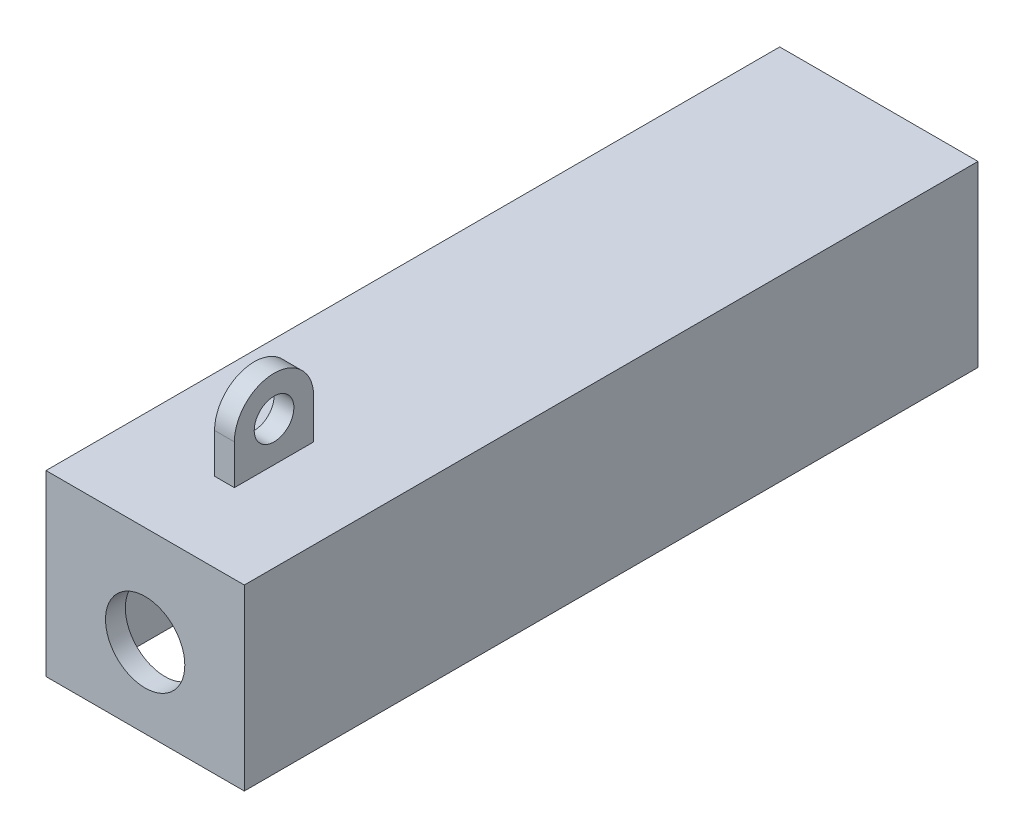
ISO-10303-21;
HEADER;
FILE_DESCRIPTION(('STEP AP214'),'2;1');
FILE_NAME('part.step','',(''),(''),'','','');
FILE_SCHEMA(('AUTOMOTIVE_DESIGN { 1 0 10303 214 1 1 1 1 }'));
ENDSEC;
DATA;
#1=APPLICATION_CONTEXT('core data for automotive mechanical design processes');
#2=APPLICATION_PROTOCOL_DEFINITION('international standard','automotive_design',2000,#1);
#3=PRODUCT_CONTEXT('',#1,'mechanical');
#4=PRODUCT('Part','Part','',(#3));
#5=PRODUCT_RELATED_PRODUCT_CATEGORY('part','',(#4));
#6=PRODUCT_DEFINITION_FORMATION('','',#4);
#7=PRODUCT_DEFINITION_CONTEXT('part definition',#1,'design');
#8=PRODUCT_DEFINITION('design','',#6,#7);
#9=PRODUCT_DEFINITION_SHAPE('','',#8);
#10=(LENGTH_UNIT() NAMED_UNIT(*) SI_UNIT(.MILLI.,.METRE.));
#11=(NAMED_UNIT(*) PLANE_ANGLE_UNIT() SI_UNIT($,.RADIAN.));
#12=(NAMED_UNIT(*) SI_UNIT($,.STERADIAN.) SOLID_ANGLE_UNIT());
#13=UNCERTAINTY_MEASURE_WITH_UNIT(LENGTH_MEASURE(1.E-05),#10,'distance_accuracy_value','');
#14=(GEOMETRIC_REPRESENTATION_CONTEXT(3) GLOBAL_UNCERTAINTY_ASSIGNED_CONTEXT((#13)) GLOBAL_UNIT_ASSIGNED_CONTEXT((#10,
#11,#12)) REPRESENTATION_CONTEXT('',''));
#15=CARTESIAN_POINT('',(0.,0.,0.));
#16=DIRECTION('',(0.,0.,1.));
#17=DIRECTION('',(1.,0.,0.));
#18=AXIS2_PLACEMENT_3D('',#15,#16,#17);
#19=CARTESIAN_POINT('',(-7.06632925965482,24.3632094956515,-22.225));
#20=DIRECTION('',(1.,0.,0.));
#21=DIRECTION('',(0.,0.,-1.));
#22=AXIS2_PLACEMENT_3D('',#19,#20,#21);
#23=PLANE('',#22);
#24=CARTESIAN_POINT('',(-7.06632925965482,18.0132094956515,-15.875));
#25=DIRECTION('',(1.,0.,0.));
#26=DIRECTION('',(0.,0.,-1.));
#27=AXIS2_PLACEMENT_3D('',#24,#25,#26);
#28=CIRCLE('',#27,3.175);
#29=CARTESIAN_POINT('',(-7.06632925965482,21.1882094956515,-15.875));
#30=VERTEX_POINT('',#29);
#31=EDGE_CURVE('E161',#30,#30,#28,.T.);
#32=ORIENTED_EDGE('',*,*,#31,.T.);
#33=EDGE_LOOP('',(#32));
#34=FACE_BOUND('',#33,.T.);
#35=DIRECTION('',(0.,-1.,0.));
#36=VECTOR('',#35,1.);
#37=CARTESIAN_POINT('',(-7.06632925965482,24.3632094956515,-9.525));
#38=LINE('',#37,#36);
#39=CARTESIAN_POINT('',(-7.06632925965483,18.0132094956515,-9.525));
#40=VERTEX_POINT('',#39);
#41=CARTESIAN_POINT('',(-7.06632925965482,11.6632094956515,-9.525));
#42=VERTEX_POINT('',#41);
#43=EDGE_CURVE('E75',#40,#42,#38,.T.);
#44=ORIENTED_EDGE('',*,*,#43,.F.);
#45=CARTESIAN_POINT('',(-7.06632925965482,18.0132094956515,-15.875));
#46=DIRECTION('',(1.,0.,0.));
#47=DIRECTION('',(0.,0.,-1.));
#48=AXIS2_PLACEMENT_3D('',#45,#46,#47);
#49=CIRCLE('',#48,6.35);
#50=CARTESIAN_POINT('',(-7.06632925965483,18.0132094956515,-22.225));
#51=VERTEX_POINT('',#50);
#52=EDGE_CURVE('E160',#51,#40,#49,.T.);
#53=ORIENTED_EDGE('',*,*,#52,.F.);
#54=DIRECTION('',(0.,-1.,0.));
#55=VECTOR('',#54,1.);
#56=CARTESIAN_POINT('',(-7.06632925965482,24.3632094956515,-22.225));
#57=LINE('',#56,#55);
#58=CARTESIAN_POINT('',(-7.06632925965482,11.6632094956515,-22.225));
#59=VERTEX_POINT('',#58);
#60=EDGE_CURVE('E168',#51,#59,#57,.T.);
#61=ORIENTED_EDGE('',*,*,#60,.T.);
#62=DIRECTION('',(0.,0.,1.));
#63=VECTOR('',#62,1.);
#64=CARTESIAN_POINT('',(-7.06632925965482,11.6632094956515,-22.225));
#65=LINE('',#64,#63);
#66=EDGE_CURVE('E327',#59,#42,#65,.T.);
#67=ORIENTED_EDGE('',*,*,#66,.T.);
#68=EDGE_LOOP('',(#44,#53,#61,#67));
#69=FACE_BOUND('',#68,.T.);
#70=ADVANCED_FACE('F58',(#34,#69),#23,.F.);
#71=CARTESIAN_POINT('',(-3.89132925965482,24.3632094956515,-22.225));
#72=DIRECTION('',(-1.,0.,0.));
#73=DIRECTION('',(0.,-1.,0.));
#74=AXIS2_PLACEMENT_3D('',#71,#72,#73);
#75=PLANE('',#74);
#76=CARTESIAN_POINT('',(-3.89132925965482,18.0132094956515,-15.875));
#77=DIRECTION('',(1.,0.,0.));
#78=DIRECTION('',(0.,1.,0.));
#79=AXIS2_PLACEMENT_3D('',#76,#77,#78);
#80=CIRCLE('',#79,3.175);
#81=CARTESIAN_POINT('',(-3.89132925965482,21.1882094956515,-15.875));
#82=VERTEX_POINT('',#81);
#83=EDGE_CURVE('E320',#82,#82,#80,.T.);
#84=ORIENTED_EDGE('',*,*,#83,.F.);
#85=EDGE_LOOP('',(#84));
#86=FACE_BOUND('',#85,.T.);
#87=CARTESIAN_POINT('',(-3.89132925965482,18.0132094956515,-15.875));
#88=DIRECTION('',(1.,0.,0.));
#89=DIRECTION('',(0.,1.,0.));
#90=AXIS2_PLACEMENT_3D('',#87,#88,#89);
#91=CIRCLE('',#90,6.35);
#92=CARTESIAN_POINT('',(-3.89132925965482,18.0132094956515,-22.225));
#93=VERTEX_POINT('',#92);
#94=CARTESIAN_POINT('',(-3.89132925965482,18.0132094956515,-9.525));
#95=VERTEX_POINT('',#94);
#96=EDGE_CURVE('E149',#93,#95,#91,.T.);
#97=ORIENTED_EDGE('',*,*,#96,.T.);
#98=DIRECTION('',(0.,-1.,0.));
#99=VECTOR('',#98,1.);
#100=CARTESIAN_POINT('',(-3.89132925965482,24.3632094956515,-9.525));
#101=LINE('',#100,#99);
#102=CARTESIAN_POINT('',(-3.89132925965482,11.6632094956515,-9.525));
#103=VERTEX_POINT('',#102);
#104=EDGE_CURVE('E83',#95,#103,#101,.T.);
#105=ORIENTED_EDGE('',*,*,#104,.T.);
#106=DIRECTION('',(0.,0.,-1.));
#107=VECTOR('',#106,1.);
#108=CARTESIAN_POINT('',(-3.89132925965482,11.6632094956515,-22.225));
#109=LINE('',#108,#107);
#110=CARTESIAN_POINT('',(-3.89132925965482,11.6632094956515,-22.225));
#111=VERTEX_POINT('',#110);
#112=EDGE_CURVE('E331',#103,#111,#109,.T.);
#113=ORIENTED_EDGE('',*,*,#112,.T.);
#114=DIRECTION('',(0.,-1.,0.));
#115=VECTOR('',#114,1.);
#116=CARTESIAN_POINT('',(-3.89132925965482,24.3632094956515,-22.225));
#117=LINE('',#116,#115);
#118=EDGE_CURVE('E152',#93,#111,#117,.T.);
#119=ORIENTED_EDGE('',*,*,#118,.F.);
#120=EDGE_LOOP('',(#97,#105,#113,#119));
#121=FACE_BOUND('',#120,.T.);
#122=ADVANCED_FACE('F151',(#86,#121),#75,.F.);
#123=CARTESIAN_POINT('',(-7.06632925965482,24.3632094956515,-9.525));
#124=DIRECTION('',(0.,0.,-1.));
#125=DIRECTION('',(-1.,0.,0.));
#126=AXIS2_PLACEMENT_3D('',#123,#124,#125);
#127=PLANE('',#126);
#128=DIRECTION('',(1.,0.,0.));
#129=VECTOR('',#128,1.);
#130=CARTESIAN_POINT('',(-21.3538292596548,18.0132094956515,-9.525));
#131=LINE('',#130,#129);
#132=EDGE_CURVE('E156',#40,#95,#131,.T.);
#133=ORIENTED_EDGE('',*,*,#132,.F.);
#134=ORIENTED_EDGE('',*,*,#43,.T.);
#135=DIRECTION('',(1.,0.,0.));
#136=VECTOR('',#135,1.);
#137=CARTESIAN_POINT('',(-7.06632925965482,11.6632094956515,-9.525));
#138=LINE('',#137,#136);
#139=EDGE_CURVE('E164',#42,#103,#138,.T.);
#140=ORIENTED_EDGE('',*,*,#139,.T.);
#141=ORIENTED_EDGE('',*,*,#104,.F.);
#142=EDGE_LOOP('',(#133,#134,#140,#141));
#143=FACE_BOUND('',#142,.T.);
#144=ADVANCED_FACE('F163',(#143),#127,.F.);
#145=CARTESIAN_POINT('',(10.3961707403452,11.6632094956515,3.175));
#146=DIRECTION('',(0.,-1.,0.));
#147=DIRECTION('',(1.,0.,0.));
#148=AXIS2_PLACEMENT_3D('',#145,#146,#147);
#149=PLANE('',#148);
#150=DIRECTION('',(0.,0.,-1.));
#151=VECTOR('',#150,1.);
#152=CARTESIAN_POINT('',(10.3961707403452,11.6632094956515,3.175));
#153=LINE('',#152,#151);
#154=CARTESIAN_POINT('',(10.3961707403452,11.6632094956515,3.175));
#155=VERTEX_POINT('',#154);
#156=CARTESIAN_POINT('',(10.3961707403452,11.6632094956515,-114.3));
#157=VERTEX_POINT('',#156);
#158=EDGE_CURVE('E12',#155,#157,#153,.T.);
#159=ORIENTED_EDGE('',*,*,#158,.T.);
#160=DIRECTION('',(1.,0.,0.));
#161=VECTOR('',#160,1.);
#162=CARTESIAN_POINT('',(10.3961707403452,11.6632094956515,-114.3));
#163=LINE('',#162,#161);
#164=CARTESIAN_POINT('',(-21.3538292596548,11.6632094956515,-114.3));
#165=VERTEX_POINT('',#164);
#166=EDGE_CURVE('E175',#165,#157,#163,.T.);
#167=ORIENTED_EDGE('',*,*,#166,.F.);
#168=DIRECTION('',(0.,0.,-1.));
#169=VECTOR('',#168,1.);
#170=CARTESIAN_POINT('',(-21.3538292596548,11.6632094956515,3.175));
#171=LINE('',#170,#169);
#172=CARTESIAN_POINT('',(-21.3538292596548,11.6632094956515,3.175));
#173=VERTEX_POINT('',#172);
#174=EDGE_CURVE('E67',#173,#165,#171,.T.);
#175=ORIENTED_EDGE('',*,*,#174,.F.);
#176=DIRECTION('',(-1.,0.,0.));
#177=VECTOR('',#176,1.);
#178=CARTESIAN_POINT('',(10.3961707403452,11.6632094956515,3.175));
#179=LINE('',#178,#177);
#180=EDGE_CURVE('E233',#155,#173,#179,.T.);
#181=ORIENTED_EDGE('',*,*,#180,.F.);
#182=EDGE_LOOP('',(#159,#167,#175,#181));
#183=FACE_BOUND('',#182,.T.);
#184=ORIENTED_EDGE('',*,*,#66,.F.);
#185=DIRECTION('',(-1.,0.,0.));
#186=VECTOR('',#185,1.);
#187=CARTESIAN_POINT('',(-7.06632925965482,11.6632094956515,-22.225));
#188=LINE('',#187,#186);
#189=EDGE_CURVE('E333',#111,#59,#188,.T.);
#190=ORIENTED_EDGE('',*,*,#189,.F.);
#191=ORIENTED_EDGE('',*,*,#112,.F.);
#192=ORIENTED_EDGE('',*,*,#139,.F.);
#193=EDGE_LOOP('',(#184,#190,#191,#192));
#194=FACE_BOUND('',#193,.T.);
#195=ADVANCED_FACE('F274',(#183,#194),#149,.F.);
#196=CARTESIAN_POINT('',(0.,0.,0.));
#197=DIRECTION('',(0.,0.,1.));
#198=DIRECTION('',(1.,0.,0.));
#199=AXIS2_PLACEMENT_3D('',#196,#197,#198);
#200=PLANE('',#199);
#201=CARTESIAN_POINT('',(-5.47882925965482,-4.21179050434855,0.));
#202=DIRECTION('',(0.,0.,1.));
#203=DIRECTION('',(1.,0.,0.));
#204=AXIS2_PLACEMENT_3D('',#201,#202,#203);
#205=CIRCLE('',#204,6.35);
#206=CARTESIAN_POINT('',(0.871170740345177,-4.21179050434855,0.));
#207=VERTEX_POINT('',#206);
#208=EDGE_CURVE('E224',#207,#207,#205,.T.);
#209=ORIENTED_EDGE('',*,*,#208,.T.);
#210=EDGE_LOOP('',(#209));
#211=FACE_BOUND('',#210,.T.);
#212=DIRECTION('',(0.,-1.,0.));
#213=VECTOR('',#212,1.);
#214=CARTESIAN_POINT('',(-18.1788292596548,-16.9117905043486,0.));
#215=LINE('',#214,#213);
#216=CARTESIAN_POINT('',(-18.1788292596548,8.48820949565145,0.));
#217=VERTEX_POINT('',#216);
#218=CARTESIAN_POINT('',(-18.1788292596548,-16.9117905043486,0.));
#219=VERTEX_POINT('',#218);
#220=EDGE_CURVE('E176',#217,#219,#215,.T.);
#221=ORIENTED_EDGE('',*,*,#220,.F.);
#222=DIRECTION('',(-1.,0.,0.));
#223=VECTOR('',#222,1.);
#224=CARTESIAN_POINT('',(-18.1788292596548,8.48820949565145,0.));
#225=LINE('',#224,#223);
#226=CARTESIAN_POINT('',(7.22117074034518,8.48820949565145,0.));
#227=VERTEX_POINT('',#226);
#228=EDGE_CURVE('E194',#227,#217,#225,.T.);
#229=ORIENTED_EDGE('',*,*,#228,.F.);
#230=DIRECTION('',(0.,1.,0.));
#231=VECTOR('',#230,1.);
#232=CARTESIAN_POINT('',(7.22117074034518,8.48820949565145,0.));
#233=LINE('',#232,#231);
#234=CARTESIAN_POINT('',(7.22117074034517,-16.9117905043485,0.));
#235=VERTEX_POINT('',#234);
#236=EDGE_CURVE('E166',#235,#227,#233,.T.);
#237=ORIENTED_EDGE('',*,*,#236,.F.);
#238=DIRECTION('',(1.,0.,0.));
#239=VECTOR('',#238,1.);
#240=CARTESIAN_POINT('',(10.3961707403452,-16.9117905043485,0.));
#241=LINE('',#240,#239);
#242=EDGE_CURVE('E227',#219,#235,#241,.T.);
#243=ORIENTED_EDGE('',*,*,#242,.F.);
#244=EDGE_LOOP('',(#221,#229,#237,#243));
#245=FACE_BOUND('',#244,.T.);
#246=ADVANCED_FACE('F254',(#211,#245),#200,.F.);
#247=CARTESIAN_POINT('',(10.3961707403452,-16.9117905043485,3.175));
#248=DIRECTION('',(-1.,0.,0.));
#249=DIRECTION('',(0.,0.,1.));
#250=AXIS2_PLACEMENT_3D('',#247,#248,#249);
#251=PLANE('',#250);
#252=DIRECTION('',(0.,0.,-1.));
#253=VECTOR('',#252,1.);
#254=CARTESIAN_POINT('',(10.3961707403452,-16.9117905043485,3.175));
#255=LINE('',#254,#253);
#256=CARTESIAN_POINT('',(10.3961707403452,-16.9117905043485,3.175));
#257=VERTEX_POINT('',#256);
#258=CARTESIAN_POINT('',(10.3961707403452,-16.9117905043485,-114.3));
#259=VERTEX_POINT('',#258);
#260=EDGE_CURVE('E239',#257,#259,#255,.T.);
#261=ORIENTED_EDGE('',*,*,#260,.T.);
#262=DIRECTION('',(0.,-1.,0.));
#263=VECTOR('',#262,1.);
#264=CARTESIAN_POINT('',(10.3961707403452,-16.9117905043485,-114.3));
#265=LINE('',#264,#263);
#266=EDGE_CURVE('E179',#157,#259,#265,.T.);
#267=ORIENTED_EDGE('',*,*,#266,.F.);
#268=ORIENTED_EDGE('',*,*,#158,.F.);
#269=DIRECTION('',(0.,1.,0.));
#270=VECTOR('',#269,1.);
#271=CARTESIAN_POINT('',(10.3961707403452,-16.9117905043485,3.175));
#272=LINE('',#271,#270);
#273=EDGE_CURVE('E230',#257,#155,#272,.T.);
#274=ORIENTED_EDGE('',*,*,#273,.F.);
#275=EDGE_LOOP('',(#261,#267,#268,#274));
#276=FACE_BOUND('',#275,.T.);
#277=ADVANCED_FACE('F60',(#276),#251,.F.);
#278=CARTESIAN_POINT('',(-21.3538292596548,-16.9117905043486,3.175));
#279=DIRECTION('',(1.,0.,0.));
#280=DIRECTION('',(0.,0.,-1.));
#281=AXIS2_PLACEMENT_3D('',#278,#279,#280);
#282=PLANE('',#281);
#283=ORIENTED_EDGE('',*,*,#174,.T.);
#284=DIRECTION('',(0.,1.,0.));
#285=VECTOR('',#284,1.);
#286=CARTESIAN_POINT('',(-21.3538292596548,11.6632094956515,-114.3));
#287=LINE('',#286,#285);
#288=CARTESIAN_POINT('',(-21.3538292596548,-16.9117905043486,-114.3));
#289=VERTEX_POINT('',#288);
#290=EDGE_CURVE('E172',#289,#165,#287,.T.);
#291=ORIENTED_EDGE('',*,*,#290,.F.);
#292=DIRECTION('',(0.,0.,-1.));
#293=VECTOR('',#292,1.);
#294=CARTESIAN_POINT('',(-21.3538292596548,-16.9117905043486,3.175));
#295=LINE('',#294,#293);
#296=CARTESIAN_POINT('',(-21.3538292596548,-16.9117905043486,3.175));
#297=VERTEX_POINT('',#296);
#298=EDGE_CURVE('E266',#297,#289,#295,.T.);
#299=ORIENTED_EDGE('',*,*,#298,.F.);
#300=DIRECTION('',(0.,-1.,0.));
#301=VECTOR('',#300,1.);
#302=CARTESIAN_POINT('',(-21.3538292596548,-16.9117905043486,3.175));
#303=LINE('',#302,#301);
#304=EDGE_CURVE('E235',#173,#297,#303,.T.);
#305=ORIENTED_EDGE('',*,*,#304,.F.);
#306=EDGE_LOOP('',(#283,#291,#299,#305));
#307=FACE_BOUND('',#306,.T.);
#308=ADVANCED_FACE('F272',(#307),#282,.F.);
#309=CARTESIAN_POINT('',(10.3961707403452,-16.9117905043485,3.175));
#310=DIRECTION('',(0.,1.,0.));
#311=DIRECTION('',(-1.,0.,0.));
#312=AXIS2_PLACEMENT_3D('',#309,#310,#311);
#313=PLANE('',#312);
#314=ORIENTED_EDGE('',*,*,#298,.T.);
#315=DIRECTION('',(-1.,0.,0.));
#316=VECTOR('',#315,1.);
#317=CARTESIAN_POINT('',(-21.3538292596548,-16.9117905043486,-114.3));
#318=LINE('',#317,#316);
#319=CARTESIAN_POINT('',(-18.1788292596548,-16.9117905043486,-114.3));
#320=VERTEX_POINT('',#319);
#321=EDGE_CURVE('E190',#320,#289,#318,.T.);
#322=ORIENTED_EDGE('',*,*,#321,.F.);
#323=DIRECTION('',(0.,0.,1.));
#324=VECTOR('',#323,1.);
#325=CARTESIAN_POINT('',(-18.1788292596548,-16.9117905043486,-114.3));
#326=LINE('',#325,#324);
#327=EDGE_CURVE('E193',#320,#219,#326,.T.);
#328=ORIENTED_EDGE('',*,*,#327,.T.);
#329=ORIENTED_EDGE('',*,*,#242,.T.);
#330=DIRECTION('',(0.,0.,1.));
#331=VECTOR('',#330,1.);
#332=CARTESIAN_POINT('',(7.22117074034517,-16.9117905043486,-114.3));
#333=LINE('',#332,#331);
#334=CARTESIAN_POINT('',(7.22117074034517,-16.9117905043486,-114.3));
#335=VERTEX_POINT('',#334);
#336=EDGE_CURVE('E217',#335,#235,#333,.T.);
#337=ORIENTED_EDGE('',*,*,#336,.F.);
#338=DIRECTION('',(-1.,0.,0.));
#339=VECTOR('',#338,1.);
#340=CARTESIAN_POINT('',(7.22117074034517,-16.9117905043486,-114.3));
#341=LINE('',#340,#339);
#342=EDGE_CURVE('E182',#259,#335,#341,.T.);
#343=ORIENTED_EDGE('',*,*,#342,.F.);
#344=ORIENTED_EDGE('',*,*,#260,.F.);
#345=DIRECTION('',(1.,0.,0.));
#346=VECTOR('',#345,1.);
#347=CARTESIAN_POINT('',(10.3961707403452,-16.9117905043485,3.175));
#348=LINE('',#347,#346);
#349=EDGE_CURVE('E237',#297,#257,#348,.T.);
#350=ORIENTED_EDGE('',*,*,#349,.F.);
#351=EDGE_LOOP('',(#314,#322,#328,#329,#337,#343,#344,#350));
#352=FACE_BOUND('',#351,.T.);
#353=ADVANCED_FACE('F255',(#352),#313,.F.);
#354=CARTESIAN_POINT('',(0.,0.,3.175));
#355=DIRECTION('',(0.,0.,1.));
#356=DIRECTION('',(1.,0.,0.));
#357=AXIS2_PLACEMENT_3D('',#354,#355,#356);
#358=PLANE('',#357);
#359=CARTESIAN_POINT('',(-5.47882925965482,-4.21179050434855,3.175));
#360=DIRECTION('',(0.,0.,1.));
#361=DIRECTION('',(1.,0.,0.));
#362=AXIS2_PLACEMENT_3D('',#359,#360,#361);
#363=CIRCLE('',#362,6.35);
#364=CARTESIAN_POINT('',(0.871170740345177,-4.21179050434855,3.175));
#365=VERTEX_POINT('',#364);
#366=EDGE_CURVE('E222',#365,#365,#363,.T.);
#367=ORIENTED_EDGE('',*,*,#366,.F.);
#368=EDGE_LOOP('',(#367));
#369=FACE_BOUND('',#368,.T.);
#370=ORIENTED_EDGE('',*,*,#273,.T.);
#371=ORIENTED_EDGE('',*,*,#180,.T.);
#372=ORIENTED_EDGE('',*,*,#304,.T.);
#373=ORIENTED_EDGE('',*,*,#349,.T.);
#374=EDGE_LOOP('',(#370,#371,#372,#373));
#375=FACE_BOUND('',#374,.T.);
#376=ADVANCED_FACE('F348',(#369,#375),#358,.T.);
#377=CARTESIAN_POINT('',(-5.47882925965482,-4.21179050434855,0.));
#378=DIRECTION('',(0.,0.,1.));
#379=DIRECTION('',(1.,0.,0.));
#380=AXIS2_PLACEMENT_3D('',#377,#378,#379);
#381=CYLINDRICAL_SURFACE('',#380,6.35);
#382=ORIENTED_EDGE('',*,*,#208,.F.);
#383=EDGE_LOOP('',(#382));
#384=FACE_BOUND('',#383,.T.);
#385=ORIENTED_EDGE('',*,*,#366,.T.);
#386=EDGE_LOOP('',(#385));
#387=FACE_BOUND('',#386,.T.);
#388=ADVANCED_FACE('F285',(#384,#387),#381,.F.);
#389=CARTESIAN_POINT('',(7.22117074034518,8.48820949565145,-114.3));
#390=DIRECTION('',(1.,0.,0.));
#391=DIRECTION('',(0.,1.,0.));
#392=AXIS2_PLACEMENT_3D('',#389,#390,#391);
#393=PLANE('',#392);
#394=ORIENTED_EDGE('',*,*,#236,.T.);
#395=DIRECTION('',(0.,0.,1.));
#396=VECTOR('',#395,1.);
#397=CARTESIAN_POINT('',(7.22117074034518,8.48820949565145,-114.3));
#398=LINE('',#397,#396);
#399=CARTESIAN_POINT('',(7.22117074034518,8.48820949565145,-114.3));
#400=VERTEX_POINT('',#399);
#401=EDGE_CURVE('E212',#400,#227,#398,.T.);
#402=ORIENTED_EDGE('',*,*,#401,.F.);
#403=DIRECTION('',(0.,1.,0.));
#404=VECTOR('',#403,1.);
#405=CARTESIAN_POINT('',(7.22117074034518,8.48820949565145,-114.3));
#406=LINE('',#405,#404);
#407=EDGE_CURVE('E184',#335,#400,#406,.T.);
#408=ORIENTED_EDGE('',*,*,#407,.F.);
#409=ORIENTED_EDGE('',*,*,#336,.T.);
#410=EDGE_LOOP('',(#394,#402,#408,#409));
#411=FACE_BOUND('',#410,.T.);
#412=ADVANCED_FACE('F250',(#411),#393,.F.);
#413=CARTESIAN_POINT('',(-18.1788292596548,8.48820949565145,-114.3));
#414=DIRECTION('',(0.,1.,0.));
#415=DIRECTION('',(-1.,0.,0.));
#416=AXIS2_PLACEMENT_3D('',#413,#414,#415);
#417=PLANE('',#416);
#418=ORIENTED_EDGE('',*,*,#228,.T.);
#419=DIRECTION('',(0.,0.,1.));
#420=VECTOR('',#419,1.);
#421=CARTESIAN_POINT('',(-18.1788292596548,8.48820949565145,-114.3));
#422=LINE('',#421,#420);
#423=CARTESIAN_POINT('',(-18.1788292596548,8.48820949565145,-114.3));
#424=VERTEX_POINT('',#423);
#425=EDGE_CURVE('E199',#424,#217,#422,.T.);
#426=ORIENTED_EDGE('',*,*,#425,.F.);
#427=DIRECTION('',(-1.,0.,0.));
#428=VECTOR('',#427,1.);
#429=CARTESIAN_POINT('',(-18.1788292596548,8.48820949565145,-114.3));
#430=LINE('',#429,#428);
#431=EDGE_CURVE('E186',#400,#424,#430,.T.);
#432=ORIENTED_EDGE('',*,*,#431,.F.);
#433=ORIENTED_EDGE('',*,*,#401,.T.);
#434=EDGE_LOOP('',(#418,#426,#432,#433));
#435=FACE_BOUND('',#434,.T.);
#436=ADVANCED_FACE('F277',(#435),#417,.F.);
#437=CARTESIAN_POINT('',(-18.1788292596548,-16.9117905043486,-114.3));
#438=DIRECTION('',(-1.,0.,0.));
#439=DIRECTION('',(0.,0.,1.));
#440=AXIS2_PLACEMENT_3D('',#437,#438,#439);
#441=PLANE('',#440);
#442=ORIENTED_EDGE('',*,*,#220,.T.);
#443=ORIENTED_EDGE('',*,*,#327,.F.);
#444=DIRECTION('',(0.,-1.,0.));
#445=VECTOR('',#444,1.);
#446=CARTESIAN_POINT('',(-18.1788292596548,-16.9117905043486,-114.3));
#447=LINE('',#446,#445);
#448=EDGE_CURVE('E188',#424,#320,#447,.T.);
#449=ORIENTED_EDGE('',*,*,#448,.F.);
#450=ORIENTED_EDGE('',*,*,#425,.T.);
#451=EDGE_LOOP('',(#442,#443,#449,#450));
#452=FACE_BOUND('',#451,.T.);
#453=ADVANCED_FACE('F276',(#452),#441,.F.);
#454=CARTESIAN_POINT('',(0.,0.,-114.3));
#455=DIRECTION('',(0.,0.,1.));
#456=DIRECTION('',(1.,0.,0.));
#457=AXIS2_PLACEMENT_3D('',#454,#455,#456);
#458=PLANE('',#457);
#459=ORIENTED_EDGE('',*,*,#290,.T.);
#460=ORIENTED_EDGE('',*,*,#166,.T.);
#461=ORIENTED_EDGE('',*,*,#266,.T.);
#462=ORIENTED_EDGE('',*,*,#342,.T.);
#463=ORIENTED_EDGE('',*,*,#407,.T.);
#464=ORIENTED_EDGE('',*,*,#431,.T.);
#465=ORIENTED_EDGE('',*,*,#448,.T.);
#466=ORIENTED_EDGE('',*,*,#321,.T.);
#467=EDGE_LOOP('',(#459,#460,#461,#462,#463,#464,#465,#466));
#468=FACE_BOUND('',#467,.T.);
#469=ADVANCED_FACE('F259',(#468),#458,.F.);
#470=CARTESIAN_POINT('',(-7.06632925965482,24.3632094956515,-22.225));
#471=DIRECTION('',(0.,0.,1.));
#472=DIRECTION('',(1.,0.,0.));
#473=AXIS2_PLACEMENT_3D('',#470,#471,#472);
#474=PLANE('',#473);
#475=ORIENTED_EDGE('',*,*,#60,.F.);
#476=DIRECTION('',(1.,0.,0.));
#477=VECTOR('',#476,1.);
#478=CARTESIAN_POINT('',(-21.3538292596548,18.0132094956515,-22.225));
#479=LINE('',#478,#477);
#480=EDGE_CURVE('E155',#51,#93,#479,.T.);
#481=ORIENTED_EDGE('',*,*,#480,.T.);
#482=ORIENTED_EDGE('',*,*,#118,.T.);
#483=ORIENTED_EDGE('',*,*,#189,.T.);
#484=EDGE_LOOP('',(#475,#481,#482,#483));
#485=FACE_BOUND('',#484,.T.);
#486=ADVANCED_FACE('F300',(#485),#474,.F.);
#487=CARTESIAN_POINT('',(-21.3538292596548,18.0132094956515,-15.875));
#488=DIRECTION('',(1.,0.,0.));
#489=DIRECTION('',(0.,1.,0.));
#490=AXIS2_PLACEMENT_3D('',#487,#488,#489);
#491=CYLINDRICAL_SURFACE('',#490,6.35);
#492=ORIENTED_EDGE('',*,*,#52,.T.);
#493=ORIENTED_EDGE('',*,*,#132,.T.);
#494=ORIENTED_EDGE('',*,*,#96,.F.);
#495=ORIENTED_EDGE('',*,*,#480,.F.);
#496=EDGE_LOOP('',(#492,#493,#494,#495));
#497=FACE_BOUND('',#496,.T.);
#498=ADVANCED_FACE('F158',(#497),#491,.T.);
#499=CARTESIAN_POINT('',(-21.3538292596548,18.0132094956515,-15.875));
#500=DIRECTION('',(1.,0.,0.));
#501=DIRECTION('',(0.,1.,0.));
#502=AXIS2_PLACEMENT_3D('',#499,#500,#501);
#503=CYLINDRICAL_SURFACE('',#502,3.175);
#504=CARTESIAN_POINT('',(-3.89132925965482,21.1882094956515,-15.875));
#505=CARTESIAN_POINT('',(-3.92440217632149,21.1882094956515,-15.875));
#506=CARTESIAN_POINT('',(-3.95747509298815,21.1882094956515,-15.875));
#507=CARTESIAN_POINT('',(-4.02362092632149,21.1882094956515,-15.875));
#508=CARTESIAN_POINT('',(-4.05669384298815,21.1882094956515,-15.875));
#509=CARTESIAN_POINT('',(-4.12283967632149,21.1882094956515,-15.875));
#510=CARTESIAN_POINT('',(-4.15591259298815,21.1882094956515,-15.875));
#511=CARTESIAN_POINT('',(-4.22205842632149,21.1882094956515,-15.875));
#512=CARTESIAN_POINT('',(-4.25513134298815,21.1882094956515,-15.875));
#513=CARTESIAN_POINT('',(-4.32127717632149,21.1882094956515,-15.875));
#514=CARTESIAN_POINT('',(-4.35435009298815,21.1882094956515,-15.875));
#515=CARTESIAN_POINT('',(-4.42049592632149,21.1882094956515,-15.875));
#516=CARTESIAN_POINT('',(-4.45356884298815,21.1882094956515,-15.875));
#517=CARTESIAN_POINT('',(-4.51971467632149,21.1882094956515,-15.875));
#518=CARTESIAN_POINT('',(-4.55278759298815,21.1882094956515,-15.875));
#519=CARTESIAN_POINT('',(-4.61893342632149,21.1882094956515,-15.875));
#520=CARTESIAN_POINT('',(-4.65200634298816,21.1882094956515,-15.875));
#521=CARTESIAN_POINT('',(-4.71815217632149,21.1882094956515,-15.875));
#522=CARTESIAN_POINT('',(-4.75122509298816,21.1882094956515,-15.875));
#523=CARTESIAN_POINT('',(-4.81737092632149,21.1882094956515,-15.875));
#524=CARTESIAN_POINT('',(-4.85044384298816,21.1882094956515,-15.875));
#525=CARTESIAN_POINT('',(-4.91658967632149,21.1882094956515,-15.875));
#526=CARTESIAN_POINT('',(-4.94966259298816,21.1882094956515,-15.875));
#527=CARTESIAN_POINT('',(-5.01580842632149,21.1882094956515,-15.875));
#528=CARTESIAN_POINT('',(-5.04888134298816,21.1882094956515,-15.875));
#529=CARTESIAN_POINT('',(-5.11502717632149,21.1882094956515,-15.875));
#530=CARTESIAN_POINT('',(-5.14810009298816,21.1882094956515,-15.875));
#531=CARTESIAN_POINT('',(-5.21424592632149,21.1882094956515,-15.875));
#532=CARTESIAN_POINT('',(-5.24731884298816,21.1882094956515,-15.875));
#533=CARTESIAN_POINT('',(-5.31346467632149,21.1882094956515,-15.875));
#534=CARTESIAN_POINT('',(-5.34653759298816,21.1882094956515,-15.875));
#535=CARTESIAN_POINT('',(-5.41268342632149,21.1882094956515,-15.875));
#536=CARTESIAN_POINT('',(-5.44575634298816,21.1882094956515,-15.875));
#537=CARTESIAN_POINT('',(-5.51190217632149,21.1882094956515,-15.875));
#538=CARTESIAN_POINT('',(-5.54497509298816,21.1882094956515,-15.875));
#539=CARTESIAN_POINT('',(-5.61112092632149,21.1882094956515,-15.875));
#540=CARTESIAN_POINT('',(-5.64419384298816,21.1882094956515,-15.875));
#541=CARTESIAN_POINT('',(-5.71033967632149,21.1882094956515,-15.875));
#542=CARTESIAN_POINT('',(-5.74341259298815,21.1882094956515,-15.875));
#543=CARTESIAN_POINT('',(-5.80955842632149,21.1882094956515,-15.875));
#544=CARTESIAN_POINT('',(-5.84263134298816,21.1882094956515,-15.875));
#545=CARTESIAN_POINT('',(-5.90877717632149,21.1882094956515,-15.875));
#546=CARTESIAN_POINT('',(-5.94185009298816,21.1882094956515,-15.875));
#547=CARTESIAN_POINT('',(-6.00799592632149,21.1882094956515,-15.875));
#548=CARTESIAN_POINT('',(-6.04106884298815,21.1882094956515,-15.875));
#549=CARTESIAN_POINT('',(-6.10721467632149,21.1882094956515,-15.875));
#550=CARTESIAN_POINT('',(-6.14028759298816,21.1882094956515,-15.875));
#551=CARTESIAN_POINT('',(-6.20643342632149,21.1882094956515,-15.875));
#552=CARTESIAN_POINT('',(-6.23950634298816,21.1882094956515,-15.875));
#553=CARTESIAN_POINT('',(-6.30565217632149,21.1882094956515,-15.875));
#554=CARTESIAN_POINT('',(-6.33872509298816,21.1882094956515,-15.875));
#555=CARTESIAN_POINT('',(-6.40487092632149,21.1882094956515,-15.875));
#556=CARTESIAN_POINT('',(-6.43794384298816,21.1882094956515,-15.875));
#557=CARTESIAN_POINT('',(-6.50408967632149,21.1882094956515,-15.875));
#558=CARTESIAN_POINT('',(-6.53716259298816,21.1882094956515,-15.875));
#559=CARTESIAN_POINT('',(-6.60330842632149,21.1882094956515,-15.875));
#560=CARTESIAN_POINT('',(-6.63638134298816,21.1882094956515,-15.875));
#561=CARTESIAN_POINT('',(-6.70252717632149,21.1882094956515,-15.875));
#562=CARTESIAN_POINT('',(-6.73560009298816,21.1882094956515,-15.875));
#563=CARTESIAN_POINT('',(-6.80174592632149,21.1882094956515,-15.875));
#564=CARTESIAN_POINT('',(-6.83481884298816,21.1882094956515,-15.875));
#565=CARTESIAN_POINT('',(-6.90096467632149,21.1882094956515,-15.875));
#566=CARTESIAN_POINT('',(-6.93403759298816,21.1882094956515,-15.875));
#567=CARTESIAN_POINT('',(-7.00018342632149,21.1882094956515,-15.875));
#568=CARTESIAN_POINT('',(-7.03325634298816,21.1882094956515,-15.875));
#569=CARTESIAN_POINT('',(-7.06632925965482,21.1882094956515,-15.875));
#570=B_SPLINE_CURVE_WITH_KNOTS('',3,(#504,#505,#506,#507,#508,#509,#510,#511,#512,#513,#514,
#515,#516,#517,#518,#519,#520,#521,#522,#523,#524,#525,#526,#527,#528,#529,#530,#531,#532,#533,
#534,#535,#536,#537,#538,#539,#540,#541,#542,#543,#544,#545,#546,#547,#548,#549,#550,#551,#552,
#553,#554,#555,#556,#557,#558,#559,#560,#561,#562,#563,#564,#565,#566,#567,#568,#569),
.UNSPECIFIED.,.F.,.F.,(4,2,2,2,2,2,2,2,2,2,2,2,2,2,2,2,2,2,2,2,2,2,2,2,2,2,2,2,2,2,2,2,4),(0.,
0.0992187500000012,0.198437499999999,0.29765625,0.396875000000001,0.496093749999999,0.5953125,
0.694531250000002,0.793750000000003,0.892968750000001,0.992187500000002,1.09140625,1.190625,
1.28984375,1.3890625,1.48828125,1.5875,1.68671875,1.7859375,1.88515625,1.984375,2.08359375,
2.1828125,2.28203125,2.38125,2.48046875,2.5796875,2.67890625,2.778125,2.87734375,2.9765625,
3.07578125,3.175),.UNSPECIFIED.);
#571=EDGE_CURVE('BSEAM309',#82,#30,#570,.T.);
#572=ORIENTED_EDGE('',*,*,#83,.T.);
#573=ORIENTED_EDGE('',*,*,#31,.F.);
#574=ORIENTED_EDGE('',*,*,#571,.T.);
#575=ORIENTED_EDGE('',*,*,#571,.F.);
#576=EDGE_LOOP('',(#572,#574,#573,#575));
#577=FACE_BOUND('',#576,.T.);
#578=ADVANCED_FACE('F309',(#577),#503,.F.);
#579=CLOSED_SHELL('',(#70,#122,#144,#195,#246,#277,#308,#353,#376,#388,#412,#436,#453,#469,#486,
#498,#578));
#580=MANIFOLD_SOLID_BREP('B2',#579);
#581=ADVANCED_BREP_SHAPE_REPRESENTATION('',(#18,#580),#14);
#582=SHAPE_DEFINITION_REPRESENTATION(#9,#581);
ENDSEC;
END-ISO-10303-21;
